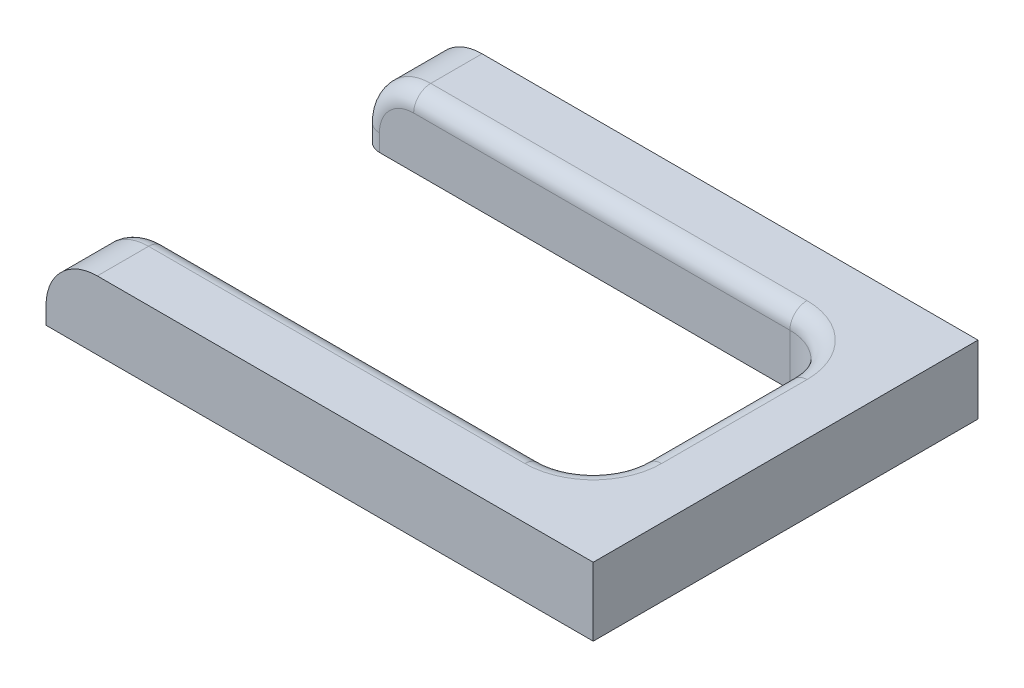
ISO-10303-21;
HEADER;
FILE_DESCRIPTION(('STEP AP214'),'2;1');
FILE_NAME('part.step','',(''),(''),'','','');
FILE_SCHEMA(('AUTOMOTIVE_DESIGN { 1 0 10303 214 1 1 1 1 }'));
ENDSEC;
DATA;
#1=APPLICATION_CONTEXT('core data for automotive mechanical design processes');
#2=APPLICATION_PROTOCOL_DEFINITION('international standard','automotive_design',2000,#1);
#3=PRODUCT_CONTEXT('',#1,'mechanical');
#4=PRODUCT('Part','Part','',(#3));
#5=PRODUCT_RELATED_PRODUCT_CATEGORY('part','',(#4));
#6=PRODUCT_DEFINITION_FORMATION('','',#4);
#7=PRODUCT_DEFINITION_CONTEXT('part definition',#1,'design');
#8=PRODUCT_DEFINITION('design','',#6,#7);
#9=PRODUCT_DEFINITION_SHAPE('','',#8);
#10=(LENGTH_UNIT() NAMED_UNIT(*) SI_UNIT(.MILLI.,.METRE.));
#11=(NAMED_UNIT(*) PLANE_ANGLE_UNIT() SI_UNIT($,.RADIAN.));
#12=(NAMED_UNIT(*) SI_UNIT($,.STERADIAN.) SOLID_ANGLE_UNIT());
#13=UNCERTAINTY_MEASURE_WITH_UNIT(LENGTH_MEASURE(1.E-05),#10,'distance_accuracy_value','');
#14=(GEOMETRIC_REPRESENTATION_CONTEXT(3) GLOBAL_UNCERTAINTY_ASSIGNED_CONTEXT((#13)) GLOBAL_UNIT_ASSIGNED_CONTEXT((#10,
#11,#12)) REPRESENTATION_CONTEXT('',''));
#15=CARTESIAN_POINT('',(0.,0.,0.));
#16=DIRECTION('',(0.,0.,1.));
#17=DIRECTION('',(1.,0.,0.));
#18=AXIS2_PLACEMENT_3D('',#15,#16,#17);
#19=CARTESIAN_POINT('',(-1.99999999999999,60.,50.));
#20=DIRECTION('',(0.,0.,-1.));
#21=DIRECTION('',(-1.,0.,0.));
#22=AXIS2_PLACEMENT_3D('',#19,#20,#21);
#23=PLANE('',#22);
#24=DIRECTION('',(1.,0.,0.));
#25=VECTOR('',#24,1.);
#26=CARTESIAN_POINT('',(-16.,60.,50.));
#27=LINE('',#26,#25);
#28=CARTESIAN_POINT('',(-14.5,60.,50.));
#29=VERTEX_POINT('',#28);
#30=CARTESIAN_POINT('',(0.,60.,50.));
#31=VERTEX_POINT('',#30);
#32=EDGE_CURVE('E155',#29,#31,#27,.T.);
#33=ORIENTED_EDGE('',*,*,#32,.F.);
#34=CARTESIAN_POINT('',(-14.5,58.5,50.));
#35=DIRECTION('',(0.,0.,-1.));
#36=DIRECTION('',(-1.,0.,0.));
#37=AXIS2_PLACEMENT_3D('',#34,#35,#36);
#38=CIRCLE('',#37,1.5);
#39=CARTESIAN_POINT('',(-16.,58.5,50.));
#40=VERTEX_POINT('',#39);
#41=EDGE_CURVE('E211',#29,#40,#38,.F.);
#42=ORIENTED_EDGE('',*,*,#41,.T.);
#43=DIRECTION('',(0.,-1.,0.));
#44=VECTOR('',#43,1.);
#45=CARTESIAN_POINT('',(-16.,60.,50.));
#46=LINE('',#45,#44);
#47=CARTESIAN_POINT('',(-16.,58.,50.));
#48=VERTEX_POINT('',#47);
#49=EDGE_CURVE('E183',#40,#48,#46,.T.);
#50=ORIENTED_EDGE('',*,*,#49,.T.);
#51=DIRECTION('',(1.,0.,0.));
#52=VECTOR('',#51,1.);
#53=CARTESIAN_POINT('',(-1.99999999999999,58.,50.));
#54=LINE('',#53,#52);
#55=CARTESIAN_POINT('',(0.,58.,50.));
#56=VERTEX_POINT('',#55);
#57=EDGE_CURVE('E172',#48,#56,#54,.T.);
#58=ORIENTED_EDGE('',*,*,#57,.T.);
#59=DIRECTION('',(0.,-1.,0.));
#60=VECTOR('',#59,1.);
#61=CARTESIAN_POINT('',(0.,60.,50.));
#62=LINE('',#61,#60);
#63=EDGE_CURVE('E169',#31,#56,#62,.T.);
#64=ORIENTED_EDGE('',*,*,#63,.F.);
#65=EDGE_LOOP('',(#33,#42,#50,#58,#64));
#66=FACE_BOUND('',#65,.T.);
#67=ADVANCED_FACE('F35',(#66),#23,.F.);
#68=CARTESIAN_POINT('',(0.,60.,50.));
#69=DIRECTION('',(-1.,0.,0.));
#70=DIRECTION('',(0.,0.,1.));
#71=AXIS2_PLACEMENT_3D('',#68,#69,#70);
#72=PLANE('',#71);
#73=DIRECTION('',(0.,0.,-1.));
#74=VECTOR('',#73,1.);
#75=CARTESIAN_POINT('',(0.,58.,50.));
#76=LINE('',#75,#74);
#77=CARTESIAN_POINT('',(0.,58.,38.75));
#78=VERTEX_POINT('',#77);
#79=EDGE_CURVE('E187',#56,#78,#76,.T.);
#80=ORIENTED_EDGE('',*,*,#79,.T.);
#81=DIRECTION('',(0.,-1.,0.));
#82=VECTOR('',#81,1.);
#83=CARTESIAN_POINT('',(0.,60.,38.75));
#84=LINE('',#83,#82);
#85=CARTESIAN_POINT('',(0.,60.,38.75));
#86=VERTEX_POINT('',#85);
#87=EDGE_CURVE('E176',#86,#78,#84,.T.);
#88=ORIENTED_EDGE('',*,*,#87,.F.);
#89=DIRECTION('',(0.,0.,-1.));
#90=VECTOR('',#89,1.);
#91=CARTESIAN_POINT('',(0.,60.,50.));
#92=LINE('',#91,#90);
#93=EDGE_CURVE('E160',#31,#86,#92,.T.);
#94=ORIENTED_EDGE('',*,*,#93,.F.);
#95=ORIENTED_EDGE('',*,*,#63,.T.);
#96=EDGE_LOOP('',(#80,#88,#94,#95));
#97=FACE_BOUND('',#96,.T.);
#98=ADVANCED_FACE('F178',(#97),#72,.F.);
#99=CARTESIAN_POINT('',(0.,60.,38.75));
#100=DIRECTION('',(0.,0.,1.));
#101=DIRECTION('',(1.,0.,0.));
#102=AXIS2_PLACEMENT_3D('',#99,#100,#101);
#103=PLANE('',#102);
#104=DIRECTION('',(0.,-1.,0.));
#105=VECTOR('',#104,1.);
#106=CARTESIAN_POINT('',(-16.,60.,38.75));
#107=LINE('',#106,#105);
#108=CARTESIAN_POINT('',(-16.,58.5,38.75));
#109=VERTEX_POINT('',#108);
#110=CARTESIAN_POINT('',(-16.,58.,38.75));
#111=VERTEX_POINT('',#110);
#112=EDGE_CURVE('E205',#109,#111,#107,.T.);
#113=ORIENTED_EDGE('',*,*,#112,.F.);
#114=CARTESIAN_POINT('',(-14.5,58.5,38.75));
#115=DIRECTION('',(0.,0.,1.));
#116=DIRECTION('',(1.,0.,0.));
#117=AXIS2_PLACEMENT_3D('',#114,#115,#116);
#118=CIRCLE('',#117,1.5);
#119=CARTESIAN_POINT('',(-14.5,60.,38.75));
#120=VERTEX_POINT('',#119);
#121=EDGE_CURVE('E218',#109,#120,#118,.F.);
#122=ORIENTED_EDGE('',*,*,#121,.T.);
#123=DIRECTION('',(-1.,0.,0.));
#124=VECTOR('',#123,1.);
#125=CARTESIAN_POINT('',(0.,60.,38.75));
#126=LINE('',#125,#124);
#127=EDGE_CURVE('E181',#86,#120,#126,.T.);
#128=ORIENTED_EDGE('',*,*,#127,.F.);
#129=ORIENTED_EDGE('',*,*,#87,.T.);
#130=DIRECTION('',(-1.,0.,0.));
#131=VECTOR('',#130,1.);
#132=CARTESIAN_POINT('',(0.,58.,38.75));
#133=LINE('',#132,#131);
#134=EDGE_CURVE('E189',#78,#111,#133,.T.);
#135=ORIENTED_EDGE('',*,*,#134,.T.);
#136=EDGE_LOOP('',(#113,#122,#128,#129,#135));
#137=FACE_BOUND('',#136,.T.);
#138=ADVANCED_FACE('F317',(#137),#103,.F.);
#139=CARTESIAN_POINT('',(-16.,60.,38.75));
#140=DIRECTION('',(1.,0.,0.));
#141=DIRECTION('',(0.,0.,-1.));
#142=AXIS2_PLACEMENT_3D('',#139,#140,#141);
#143=PLANE('',#142);
#144=DIRECTION('',(0.,0.,1.));
#145=VECTOR('',#144,1.);
#146=CARTESIAN_POINT('',(-16.,58.,38.75));
#147=LINE('',#146,#145);
#148=CARTESIAN_POINT('',(-16.,58.,40.25));
#149=VERTEX_POINT('',#148);
#150=EDGE_CURVE('E192',#111,#149,#147,.T.);
#151=ORIENTED_EDGE('',*,*,#150,.T.);
#152=DIRECTION('',(0.,-1.,0.));
#153=VECTOR('',#152,1.);
#154=CARTESIAN_POINT('',(-16.,60.,40.25));
#155=LINE('',#154,#153);
#156=CARTESIAN_POINT('',(-16.,58.5,40.25));
#157=VERTEX_POINT('',#156);
#158=EDGE_CURVE('E245',#149,#157,#155,.F.);
#159=ORIENTED_EDGE('',*,*,#158,.T.);
#160=DIRECTION('',(0.,0.,1.));
#161=VECTOR('',#160,1.);
#162=CARTESIAN_POINT('',(-16.,58.5,38.75));
#163=LINE('',#162,#161);
#164=EDGE_CURVE('E216',#157,#109,#163,.F.);
#165=ORIENTED_EDGE('',*,*,#164,.T.);
#166=ORIENTED_EDGE('',*,*,#112,.T.);
#167=EDGE_LOOP('',(#151,#159,#165,#166));
#168=FACE_BOUND('',#167,.T.);
#169=ADVANCED_FACE('F371',(#168),#143,.F.);
#170=CARTESIAN_POINT('',(-15.,60.,40.75));
#171=DIRECTION('',(0.,0.,-1.));
#172=DIRECTION('',(-1.,0.,0.));
#173=AXIS2_PLACEMENT_3D('',#170,#171,#172);
#174=PLANE('',#173);
#175=CARTESIAN_POINT('',(-14.5,58.5,40.75));
#176=DIRECTION('',(0.,0.,-1.));
#177=DIRECTION('',(-1.,0.,0.));
#178=AXIS2_PLACEMENT_3D('',#175,#176,#177);
#179=CIRCLE('',#178,1.);
#180=CARTESIAN_POINT('',(-14.5,59.5,40.75));
#181=VERTEX_POINT('',#180);
#182=CARTESIAN_POINT('',(-15.5,58.5,40.75));
#183=VERTEX_POINT('',#182);
#184=EDGE_CURVE('E236',#181,#183,#179,.F.);
#185=ORIENTED_EDGE('',*,*,#184,.T.);
#186=DIRECTION('',(0.,-1.,0.));
#187=VECTOR('',#186,1.);
#188=CARTESIAN_POINT('',(-15.5,60.,40.75));
#189=LINE('',#188,#187);
#190=CARTESIAN_POINT('',(-15.5,58.,40.75));
#191=VERTEX_POINT('',#190);
#192=EDGE_CURVE('E238',#183,#191,#189,.T.);
#193=ORIENTED_EDGE('',*,*,#192,.T.);
#194=DIRECTION('',(1.,0.,0.));
#195=VECTOR('',#194,1.);
#196=CARTESIAN_POINT('',(-15.,58.,40.75));
#197=LINE('',#196,#195);
#198=CARTESIAN_POINT('',(-3.5,58.,40.75));
#199=VERTEX_POINT('',#198);
#200=EDGE_CURVE('E195',#191,#199,#197,.T.);
#201=ORIENTED_EDGE('',*,*,#200,.T.);
#202=DIRECTION('',(0.,-1.,0.));
#203=VECTOR('',#202,1.);
#204=CARTESIAN_POINT('',(-3.49999999999999,60.,40.75));
#205=LINE('',#204,#203);
#206=CARTESIAN_POINT('',(-3.49999999999999,59.5,40.75));
#207=VERTEX_POINT('',#206);
#208=EDGE_CURVE('E226',#199,#207,#205,.F.);
#209=ORIENTED_EDGE('',*,*,#208,.T.);
#210=DIRECTION('',(1.,0.,0.));
#211=VECTOR('',#210,1.);
#212=CARTESIAN_POINT('',(-14.5,59.5,40.75));
#213=LINE('',#212,#211);
#214=EDGE_CURVE('E234',#207,#181,#213,.F.);
#215=ORIENTED_EDGE('',*,*,#214,.T.);
#216=EDGE_LOOP('',(#185,#193,#201,#209,#215));
#217=FACE_BOUND('',#216,.T.);
#218=ADVANCED_FACE('F335',(#217),#174,.F.);
#219=CARTESIAN_POINT('',(-1.99999999999999,60.,40.75));
#220=DIRECTION('',(1.,0.,0.));
#221=DIRECTION('',(0.,0.,-1.));
#222=AXIS2_PLACEMENT_3D('',#219,#220,#221);
#223=PLANE('',#222);
#224=DIRECTION('',(0.,-1.,0.));
#225=VECTOR('',#224,1.);
#226=CARTESIAN_POINT('',(-1.99999999999999,60.,46.5));
#227=LINE('',#226,#225);
#228=CARTESIAN_POINT('',(-1.99999999999999,58.,46.5));
#229=VERTEX_POINT('',#228);
#230=CARTESIAN_POINT('',(-1.99999999999999,59.5,46.5));
#231=VERTEX_POINT('',#230);
#232=EDGE_CURVE('E224',#229,#231,#227,.F.);
#233=ORIENTED_EDGE('',*,*,#232,.T.);
#234=DIRECTION('',(0.,0.,1.));
#235=VECTOR('',#234,1.);
#236=CARTESIAN_POINT('',(-1.99999999999999,59.5,42.25));
#237=LINE('',#236,#235);
#238=CARTESIAN_POINT('',(-1.99999999999999,59.5,42.25));
#239=VERTEX_POINT('',#238);
#240=EDGE_CURVE('E44',#231,#239,#237,.F.);
#241=ORIENTED_EDGE('',*,*,#240,.T.);
#242=DIRECTION('',(0.,-1.,0.));
#243=VECTOR('',#242,1.);
#244=CARTESIAN_POINT('',(-1.99999999999999,58.,42.25));
#245=LINE('',#244,#243);
#246=CARTESIAN_POINT('',(-1.99999999999999,58.,42.25));
#247=VERTEX_POINT('',#246);
#248=EDGE_CURVE('E222',#239,#247,#245,.T.);
#249=ORIENTED_EDGE('',*,*,#248,.T.);
#250=DIRECTION('',(0.,0.,1.));
#251=VECTOR('',#250,1.);
#252=CARTESIAN_POINT('',(-1.99999999999999,58.,40.75));
#253=LINE('',#252,#251);
#254=EDGE_CURVE('E197',#247,#229,#253,.T.);
#255=ORIENTED_EDGE('',*,*,#254,.T.);
#256=EDGE_LOOP('',(#233,#241,#249,#255));
#257=FACE_BOUND('',#256,.T.);
#258=ADVANCED_FACE('F363',(#257),#223,.F.);
#259=CARTESIAN_POINT('',(-1.99999999999999,60.,48.));
#260=DIRECTION('',(0.,0.,1.));
#261=DIRECTION('',(1.,0.,0.));
#262=AXIS2_PLACEMENT_3D('',#259,#260,#261);
#263=PLANE('',#262);
#264=DIRECTION('',(-1.,0.,0.));
#265=VECTOR('',#264,1.);
#266=CARTESIAN_POINT('',(-1.99999999999999,58.,48.));
#267=LINE('',#266,#265);
#268=CARTESIAN_POINT('',(-3.49999999999999,58.,48.));
#269=VERTEX_POINT('',#268);
#270=CARTESIAN_POINT('',(-15.5,58.,48.));
#271=VERTEX_POINT('',#270);
#272=EDGE_CURVE('E200',#269,#271,#267,.T.);
#273=ORIENTED_EDGE('',*,*,#272,.T.);
#274=DIRECTION('',(0.,-1.,0.));
#275=VECTOR('',#274,1.);
#276=CARTESIAN_POINT('',(-15.5,60.,48.));
#277=LINE('',#276,#275);
#278=CARTESIAN_POINT('',(-15.5,58.5,48.));
#279=VERTEX_POINT('',#278);
#280=EDGE_CURVE('E255',#271,#279,#277,.F.);
#281=ORIENTED_EDGE('',*,*,#280,.T.);
#282=CARTESIAN_POINT('',(-14.5,58.5,48.));
#283=DIRECTION('',(0.,0.,1.));
#284=DIRECTION('',(1.,0.,0.));
#285=AXIS2_PLACEMENT_3D('',#282,#283,#284);
#286=CIRCLE('',#285,1.);
#287=CARTESIAN_POINT('',(-14.5,59.5,48.));
#288=VERTEX_POINT('',#287);
#289=EDGE_CURVE('E253',#279,#288,#286,.F.);
#290=ORIENTED_EDGE('',*,*,#289,.T.);
#291=DIRECTION('',(-1.,0.,0.));
#292=VECTOR('',#291,1.);
#293=CARTESIAN_POINT('',(-3.49999999999999,59.5,48.));
#294=LINE('',#293,#292);
#295=CARTESIAN_POINT('',(-3.49999999999999,59.5,48.));
#296=VERTEX_POINT('',#295);
#297=EDGE_CURVE('E251',#288,#296,#294,.F.);
#298=ORIENTED_EDGE('',*,*,#297,.T.);
#299=DIRECTION('',(0.,-1.,0.));
#300=VECTOR('',#299,1.);
#301=CARTESIAN_POINT('',(-3.49999999999999,58.,48.));
#302=LINE('',#301,#300);
#303=EDGE_CURVE('E220',#296,#269,#302,.T.);
#304=ORIENTED_EDGE('',*,*,#303,.T.);
#305=EDGE_LOOP('',(#273,#281,#290,#298,#304));
#306=FACE_BOUND('',#305,.T.);
#307=ADVANCED_FACE('F360',(#306),#263,.F.);
#308=CARTESIAN_POINT('',(-16.,60.,50.));
#309=DIRECTION('',(1.,0.,0.));
#310=DIRECTION('',(0.,0.,-1.));
#311=AXIS2_PLACEMENT_3D('',#308,#309,#310);
#312=PLANE('',#311);
#313=DIRECTION('',(0.,0.,1.));
#314=VECTOR('',#313,1.);
#315=CARTESIAN_POINT('',(-16.,58.5,48.));
#316=LINE('',#315,#314);
#317=CARTESIAN_POINT('',(-16.,58.5,48.5));
#318=VERTEX_POINT('',#317);
#319=EDGE_CURVE('E213',#40,#318,#316,.F.);
#320=ORIENTED_EDGE('',*,*,#319,.T.);
#321=DIRECTION('',(0.,-1.,0.));
#322=VECTOR('',#321,1.);
#323=CARTESIAN_POINT('',(-16.,60.,48.5));
#324=LINE('',#323,#322);
#325=CARTESIAN_POINT('',(-16.,58.,48.5));
#326=VERTEX_POINT('',#325);
#327=EDGE_CURVE('E249',#318,#326,#324,.T.);
#328=ORIENTED_EDGE('',*,*,#327,.T.);
#329=DIRECTION('',(0.,0.,1.));
#330=VECTOR('',#329,1.);
#331=CARTESIAN_POINT('',(-16.,58.,50.));
#332=LINE('',#331,#330);
#333=EDGE_CURVE('E166',#326,#48,#332,.T.);
#334=ORIENTED_EDGE('',*,*,#333,.T.);
#335=ORIENTED_EDGE('',*,*,#49,.F.);
#336=EDGE_LOOP('',(#320,#328,#334,#335));
#337=FACE_BOUND('',#336,.T.);
#338=ADVANCED_FACE('F306',(#337),#312,.F.);
#339=CARTESIAN_POINT('',(0.,60.,50.));
#340=DIRECTION('',(0.,1.,0.));
#341=DIRECTION('',(0.,0.,1.));
#342=AXIS2_PLACEMENT_3D('',#339,#340,#341);
#343=PLANE('',#342);
#344=CARTESIAN_POINT('',(-3.49999999999999,60.,46.5));
#345=DIRECTION('',(0.,1.,0.));
#346=DIRECTION('',(0.,0.,1.));
#347=AXIS2_PLACEMENT_3D('',#344,#345,#346);
#348=CIRCLE('',#347,2.);
#349=CARTESIAN_POINT('',(-1.49999999999999,60.,46.5));
#350=VERTEX_POINT('',#349);
#351=CARTESIAN_POINT('',(-3.49999999999999,60.,48.5));
#352=VERTEX_POINT('',#351);
#353=EDGE_CURVE('E265',#350,#352,#348,.F.);
#354=ORIENTED_EDGE('',*,*,#353,.T.);
#355=DIRECTION('',(-1.,0.,0.));
#356=VECTOR('',#355,1.);
#357=CARTESIAN_POINT('',(-14.5,60.,48.5));
#358=LINE('',#357,#356);
#359=CARTESIAN_POINT('',(-14.5,60.,48.5));
#360=VERTEX_POINT('',#359);
#361=EDGE_CURVE('E267',#352,#360,#358,.T.);
#362=ORIENTED_EDGE('',*,*,#361,.T.);
#363=DIRECTION('',(0.,0.,1.));
#364=VECTOR('',#363,1.);
#365=CARTESIAN_POINT('',(-14.5,60.,50.));
#366=LINE('',#365,#364);
#367=EDGE_CURVE('E163',#360,#29,#366,.T.);
#368=ORIENTED_EDGE('',*,*,#367,.T.);
#369=ORIENTED_EDGE('',*,*,#32,.T.);
#370=ORIENTED_EDGE('',*,*,#93,.T.);
#371=ORIENTED_EDGE('',*,*,#127,.T.);
#372=DIRECTION('',(0.,0.,1.));
#373=VECTOR('',#372,1.);
#374=CARTESIAN_POINT('',(-14.5,60.,40.75));
#375=LINE('',#374,#373);
#376=CARTESIAN_POINT('',(-14.5,60.,40.25));
#377=VERTEX_POINT('',#376);
#378=EDGE_CURVE('E175',#120,#377,#375,.T.);
#379=ORIENTED_EDGE('',*,*,#378,.T.);
#380=DIRECTION('',(1.,0.,0.));
#381=VECTOR('',#380,1.);
#382=CARTESIAN_POINT('',(-3.49999999999999,60.,40.25));
#383=LINE('',#382,#381);
#384=CARTESIAN_POINT('',(-3.49999999999999,60.,40.25));
#385=VERTEX_POINT('',#384);
#386=EDGE_CURVE('E259',#377,#385,#383,.T.);
#387=ORIENTED_EDGE('',*,*,#386,.T.);
#388=CARTESIAN_POINT('',(-3.49999999999999,60.,42.25));
#389=DIRECTION('',(0.,1.,0.));
#390=DIRECTION('',(0.,0.,1.));
#391=AXIS2_PLACEMENT_3D('',#388,#389,#390);
#392=CIRCLE('',#391,2.);
#393=CARTESIAN_POINT('',(-1.49999999999999,60.,42.25));
#394=VERTEX_POINT('',#393);
#395=EDGE_CURVE('E261',#385,#394,#392,.F.);
#396=ORIENTED_EDGE('',*,*,#395,.T.);
#397=DIRECTION('',(0.,0.,1.));
#398=VECTOR('',#397,1.);
#399=CARTESIAN_POINT('',(-1.49999999999999,60.,46.5));
#400=LINE('',#399,#398);
#401=EDGE_CURVE('E263',#394,#350,#400,.T.);
#402=ORIENTED_EDGE('',*,*,#401,.T.);
#403=EDGE_LOOP('',(#354,#362,#368,#369,#370,#371,#379,#387,#396,#402));
#404=FACE_BOUND('',#403,.T.);
#405=ADVANCED_FACE('F157',(#404),#343,.T.);
#406=CARTESIAN_POINT('',(0.,58.,50.));
#407=DIRECTION('',(0.,1.,0.));
#408=DIRECTION('',(0.,0.,1.));
#409=AXIS2_PLACEMENT_3D('',#406,#407,#408);
#410=PLANE('',#409);
#411=ORIENTED_EDGE('',*,*,#200,.F.);
#412=CARTESIAN_POINT('',(-15.5,58.,40.25));
#413=DIRECTION('',(0.,1.,0.));
#414=DIRECTION('',(0.,0.,1.));
#415=AXIS2_PLACEMENT_3D('',#412,#413,#414);
#416=CIRCLE('',#415,0.5);
#417=EDGE_CURVE('E243',#191,#149,#416,.F.);
#418=ORIENTED_EDGE('',*,*,#417,.T.);
#419=ORIENTED_EDGE('',*,*,#150,.F.);
#420=ORIENTED_EDGE('',*,*,#134,.F.);
#421=ORIENTED_EDGE('',*,*,#79,.F.);
#422=ORIENTED_EDGE('',*,*,#57,.F.);
#423=ORIENTED_EDGE('',*,*,#333,.F.);
#424=CARTESIAN_POINT('',(-15.5,58.,48.5));
#425=DIRECTION('',(0.,1.,0.));
#426=DIRECTION('',(0.,0.,1.));
#427=AXIS2_PLACEMENT_3D('',#424,#425,#426);
#428=CIRCLE('',#427,0.5);
#429=EDGE_CURVE('E241',#326,#271,#428,.F.);
#430=ORIENTED_EDGE('',*,*,#429,.T.);
#431=ORIENTED_EDGE('',*,*,#272,.F.);
#432=CARTESIAN_POINT('',(-3.49999999999999,58.,46.5));
#433=DIRECTION('',(0.,1.,0.));
#434=DIRECTION('',(0.,0.,1.));
#435=AXIS2_PLACEMENT_3D('',#432,#433,#434);
#436=CIRCLE('',#435,1.5);
#437=EDGE_CURVE('E229',#269,#229,#436,.T.);
#438=ORIENTED_EDGE('',*,*,#437,.T.);
#439=ORIENTED_EDGE('',*,*,#254,.F.);
#440=CARTESIAN_POINT('',(-3.49999999999999,58.,42.25));
#441=DIRECTION('',(0.,1.,0.));
#442=DIRECTION('',(0.,0.,1.));
#443=AXIS2_PLACEMENT_3D('',#440,#441,#442);
#444=CIRCLE('',#443,1.5);
#445=EDGE_CURVE('E231',#247,#199,#444,.T.);
#446=ORIENTED_EDGE('',*,*,#445,.T.);
#447=EDGE_LOOP('',(#411,#418,#419,#420,#421,#422,#423,#430,#431,#438,#439,#446));
#448=FACE_BOUND('',#447,.T.);
#449=ADVANCED_FACE('F311',(#448),#410,.F.);
#450=CARTESIAN_POINT('',(-14.5,58.5,50.));
#451=DIRECTION('',(0.,0.,-1.));
#452=DIRECTION('',(-1.,0.,0.));
#453=AXIS2_PLACEMENT_3D('',#450,#451,#452);
#454=CYLINDRICAL_SURFACE('',#453,1.5);
#455=ORIENTED_EDGE('',*,*,#367,.F.);
#456=CARTESIAN_POINT('',(-14.5,58.5,48.5));
#457=DIRECTION('',(0.,0.,1.));
#458=DIRECTION('',(1.,0.,0.));
#459=AXIS2_PLACEMENT_3D('',#456,#457,#458);
#460=CIRCLE('',#459,1.5);
#461=EDGE_CURVE('E257',#360,#318,#460,.T.);
#462=ORIENTED_EDGE('',*,*,#461,.T.);
#463=ORIENTED_EDGE('',*,*,#319,.F.);
#464=ORIENTED_EDGE('',*,*,#41,.F.);
#465=EDGE_LOOP('',(#455,#462,#463,#464));
#466=FACE_BOUND('',#465,.T.);
#467=ADVANCED_FACE('F381',(#466),#454,.T.);
#468=CARTESIAN_POINT('',(-14.5,58.5,50.));
#469=DIRECTION('',(0.,0.,-1.));
#470=DIRECTION('',(-1.,0.,0.));
#471=AXIS2_PLACEMENT_3D('',#468,#469,#470);
#472=CYLINDRICAL_SURFACE('',#471,1.5);
#473=ORIENTED_EDGE('',*,*,#164,.F.);
#474=CARTESIAN_POINT('',(-14.5,58.5,40.25));
#475=DIRECTION('',(0.,0.,-1.));
#476=DIRECTION('',(-1.,0.,0.));
#477=AXIS2_PLACEMENT_3D('',#474,#475,#476);
#478=CIRCLE('',#477,1.5);
#479=EDGE_CURVE('E247',#157,#377,#478,.T.);
#480=ORIENTED_EDGE('',*,*,#479,.T.);
#481=ORIENTED_EDGE('',*,*,#378,.F.);
#482=ORIENTED_EDGE('',*,*,#121,.F.);
#483=EDGE_LOOP('',(#473,#480,#481,#482));
#484=FACE_BOUND('',#483,.T.);
#485=ADVANCED_FACE('F323',(#484),#472,.T.);
#486=CARTESIAN_POINT('',(-3.49999999999999,60.,46.5));
#487=DIRECTION('',(0.,1.,0.));
#488=DIRECTION('',(0.,0.,1.));
#489=AXIS2_PLACEMENT_3D('',#486,#487,#488);
#490=CYLINDRICAL_SURFACE('',#489,1.5);
#491=ORIENTED_EDGE('',*,*,#303,.F.);
#492=CARTESIAN_POINT('',(-3.49999999999999,59.5,46.5));
#493=DIRECTION('',(0.,1.,0.));
#494=DIRECTION('',(0.,0.,1.));
#495=AXIS2_PLACEMENT_3D('',#492,#493,#494);
#496=CIRCLE('',#495,1.5);
#497=EDGE_CURVE('E59',#296,#231,#496,.T.);
#498=ORIENTED_EDGE('',*,*,#497,.T.);
#499=ORIENTED_EDGE('',*,*,#232,.F.);
#500=ORIENTED_EDGE('',*,*,#437,.F.);
#501=EDGE_LOOP('',(#491,#498,#499,#500));
#502=FACE_BOUND('',#501,.T.);
#503=ADVANCED_FACE('F362',(#502),#490,.F.);
#504=CARTESIAN_POINT('',(-3.49999999999999,60.,42.25));
#505=DIRECTION('',(0.,1.,0.));
#506=DIRECTION('',(0.,0.,1.));
#507=AXIS2_PLACEMENT_3D('',#504,#505,#506);
#508=CYLINDRICAL_SURFACE('',#507,1.5);
#509=ORIENTED_EDGE('',*,*,#248,.F.);
#510=CARTESIAN_POINT('',(-3.49999999999999,59.5,42.25));
#511=DIRECTION('',(0.,1.,0.));
#512=DIRECTION('',(0.,0.,1.));
#513=AXIS2_PLACEMENT_3D('',#510,#511,#512);
#514=CIRCLE('',#513,1.5);
#515=EDGE_CURVE('E11',#239,#207,#514,.T.);
#516=ORIENTED_EDGE('',*,*,#515,.T.);
#517=ORIENTED_EDGE('',*,*,#208,.F.);
#518=ORIENTED_EDGE('',*,*,#445,.F.);
#519=EDGE_LOOP('',(#509,#516,#517,#518));
#520=FACE_BOUND('',#519,.T.);
#521=ADVANCED_FACE('F340',(#520),#508,.F.);
#522=CARTESIAN_POINT('',(-15.5,60.,48.5));
#523=DIRECTION('',(0.,-1.,0.));
#524=DIRECTION('',(0.,0.,-1.));
#525=AXIS2_PLACEMENT_3D('',#522,#523,#524);
#526=CYLINDRICAL_SURFACE('',#525,0.5);
#527=ORIENTED_EDGE('',*,*,#429,.F.);
#528=ORIENTED_EDGE('',*,*,#327,.F.);
#529=CARTESIAN_POINT('',(-15.5,58.5,48.5));
#530=DIRECTION('',(0.,1.,0.));
#531=DIRECTION('',(0.,0.,1.));
#532=AXIS2_PLACEMENT_3D('',#529,#530,#531);
#533=CIRCLE('',#532,0.5);
#534=EDGE_CURVE('E39',#279,#318,#533,.T.);
#535=ORIENTED_EDGE('',*,*,#534,.F.);
#536=ORIENTED_EDGE('',*,*,#280,.F.);
#537=EDGE_LOOP('',(#527,#528,#535,#536));
#538=FACE_BOUND('',#537,.T.);
#539=ADVANCED_FACE('F37',(#538),#526,.T.);
#540=CARTESIAN_POINT('',(-14.5,58.5,48.5));
#541=DIRECTION('',(0.,0.,1.));
#542=DIRECTION('',(1.,0.,0.));
#543=AXIS2_PLACEMENT_3D('',#540,#541,#542);
#544=TOROIDAL_SURFACE('',#543,1.,0.5);
#545=ORIENTED_EDGE('',*,*,#534,.T.);
#546=ORIENTED_EDGE('',*,*,#461,.F.);
#547=CARTESIAN_POINT('',(-14.5,59.5,48.5));
#548=DIRECTION('',(1.,0.,0.));
#549=DIRECTION('',(0.,0.,-1.));
#550=AXIS2_PLACEMENT_3D('',#547,#548,#549);
#551=CIRCLE('',#550,0.5);
#552=EDGE_CURVE('E288',#288,#360,#551,.T.);
#553=ORIENTED_EDGE('',*,*,#552,.F.);
#554=ORIENTED_EDGE('',*,*,#289,.F.);
#555=EDGE_LOOP('',(#545,#546,#553,#554));
#556=FACE_BOUND('',#555,.T.);
#557=ADVANCED_FACE('F299',(#556),#544,.T.);
#558=CARTESIAN_POINT('',(0.,59.5,48.5));
#559=DIRECTION('',(1.,0.,0.));
#560=DIRECTION('',(0.,0.,-1.));
#561=AXIS2_PLACEMENT_3D('',#558,#559,#560);
#562=CYLINDRICAL_SURFACE('',#561,0.5);
#563=ORIENTED_EDGE('',*,*,#552,.T.);
#564=ORIENTED_EDGE('',*,*,#361,.F.);
#565=CARTESIAN_POINT('',(-3.49999999999999,59.5,48.5));
#566=DIRECTION('',(1.,0.,0.));
#567=DIRECTION('',(0.,0.,-1.));
#568=AXIS2_PLACEMENT_3D('',#565,#566,#567);
#569=CIRCLE('',#568,0.5);
#570=EDGE_CURVE('E286',#296,#352,#569,.T.);
#571=ORIENTED_EDGE('',*,*,#570,.F.);
#572=ORIENTED_EDGE('',*,*,#297,.F.);
#573=EDGE_LOOP('',(#563,#564,#571,#572));
#574=FACE_BOUND('',#573,.T.);
#575=ADVANCED_FACE('F358',(#574),#562,.T.);
#576=CARTESIAN_POINT('',(-3.49999999999999,59.5,46.5));
#577=DIRECTION('',(0.,1.,0.));
#578=DIRECTION('',(0.,0.,1.));
#579=AXIS2_PLACEMENT_3D('',#576,#577,#578);
#580=TOROIDAL_SURFACE('',#579,2.,0.5);
#581=ORIENTED_EDGE('',*,*,#570,.T.);
#582=ORIENTED_EDGE('',*,*,#353,.F.);
#583=CARTESIAN_POINT('',(-1.49999999999999,59.5,46.5));
#584=DIRECTION('',(0.,0.,-1.));
#585=DIRECTION('',(-1.,0.,0.));
#586=AXIS2_PLACEMENT_3D('',#583,#584,#585);
#587=CIRCLE('',#586,0.5);
#588=EDGE_CURVE('E283',#231,#350,#587,.T.);
#589=ORIENTED_EDGE('',*,*,#588,.F.);
#590=ORIENTED_EDGE('',*,*,#497,.F.);
#591=EDGE_LOOP('',(#581,#582,#589,#590));
#592=FACE_BOUND('',#591,.T.);
#593=ADVANCED_FACE('F356',(#592),#580,.T.);
#594=CARTESIAN_POINT('',(-1.49999999999999,59.5,50.));
#595=DIRECTION('',(0.,0.,-1.));
#596=DIRECTION('',(-1.,0.,0.));
#597=AXIS2_PLACEMENT_3D('',#594,#595,#596);
#598=CYLINDRICAL_SURFACE('',#597,0.5);
#599=ORIENTED_EDGE('',*,*,#588,.T.);
#600=ORIENTED_EDGE('',*,*,#401,.F.);
#601=CARTESIAN_POINT('',(-1.49999999999999,59.5,42.25));
#602=DIRECTION('',(0.,0.,-1.));
#603=DIRECTION('',(-1.,0.,0.));
#604=AXIS2_PLACEMENT_3D('',#601,#602,#603);
#605=CIRCLE('',#604,0.5);
#606=EDGE_CURVE('E280',#239,#394,#605,.T.);
#607=ORIENTED_EDGE('',*,*,#606,.F.);
#608=ORIENTED_EDGE('',*,*,#240,.F.);
#609=EDGE_LOOP('',(#599,#600,#607,#608));
#610=FACE_BOUND('',#609,.T.);
#611=ADVANCED_FACE('F353',(#610),#598,.T.);
#612=CARTESIAN_POINT('',(-3.49999999999999,59.5,42.25));
#613=DIRECTION('',(0.,1.,0.));
#614=DIRECTION('',(0.,0.,1.));
#615=AXIS2_PLACEMENT_3D('',#612,#613,#614);
#616=TOROIDAL_SURFACE('',#615,2.,0.5);
#617=ORIENTED_EDGE('',*,*,#606,.T.);
#618=ORIENTED_EDGE('',*,*,#395,.F.);
#619=CARTESIAN_POINT('',(-3.49999999999999,59.5,40.25));
#620=DIRECTION('',(-1.,0.,0.));
#621=DIRECTION('',(0.,0.,1.));
#622=AXIS2_PLACEMENT_3D('',#619,#620,#621);
#623=CIRCLE('',#622,0.5);
#624=EDGE_CURVE('E277',#207,#385,#623,.T.);
#625=ORIENTED_EDGE('',*,*,#624,.F.);
#626=ORIENTED_EDGE('',*,*,#515,.F.);
#627=EDGE_LOOP('',(#617,#618,#625,#626));
#628=FACE_BOUND('',#627,.T.);
#629=ADVANCED_FACE('F346',(#628),#616,.T.);
#630=CARTESIAN_POINT('',(0.,59.5,40.25));
#631=DIRECTION('',(-1.,0.,0.));
#632=DIRECTION('',(0.,0.,1.));
#633=AXIS2_PLACEMENT_3D('',#630,#631,#632);
#634=CYLINDRICAL_SURFACE('',#633,0.5);
#635=ORIENTED_EDGE('',*,*,#624,.T.);
#636=ORIENTED_EDGE('',*,*,#386,.F.);
#637=CARTESIAN_POINT('',(-14.5,59.5,40.25));
#638=DIRECTION('',(-1.,0.,0.));
#639=DIRECTION('',(0.,0.,1.));
#640=AXIS2_PLACEMENT_3D('',#637,#638,#639);
#641=CIRCLE('',#640,0.5);
#642=EDGE_CURVE('E274',#181,#377,#641,.T.);
#643=ORIENTED_EDGE('',*,*,#642,.F.);
#644=ORIENTED_EDGE('',*,*,#214,.F.);
#645=EDGE_LOOP('',(#635,#636,#643,#644));
#646=FACE_BOUND('',#645,.T.);
#647=ADVANCED_FACE('F348',(#646),#634,.T.);
#648=CARTESIAN_POINT('',(-14.5,58.5,40.25));
#649=DIRECTION('',(0.,0.,-1.));
#650=DIRECTION('',(-1.,0.,0.));
#651=AXIS2_PLACEMENT_3D('',#648,#649,#650);
#652=TOROIDAL_SURFACE('',#651,1.,0.5);
#653=ORIENTED_EDGE('',*,*,#642,.T.);
#654=ORIENTED_EDGE('',*,*,#479,.F.);
#655=CARTESIAN_POINT('',(-15.5,58.5,40.25));
#656=DIRECTION('',(0.,-1.,0.));
#657=DIRECTION('',(0.,0.,-1.));
#658=AXIS2_PLACEMENT_3D('',#655,#656,#657);
#659=CIRCLE('',#658,0.5);
#660=EDGE_CURVE('E271',#183,#157,#659,.T.);
#661=ORIENTED_EDGE('',*,*,#660,.F.);
#662=ORIENTED_EDGE('',*,*,#184,.F.);
#663=EDGE_LOOP('',(#653,#654,#661,#662));
#664=FACE_BOUND('',#663,.T.);
#665=ADVANCED_FACE('F327',(#664),#652,.T.);
#666=CARTESIAN_POINT('',(-15.5,60.,40.25));
#667=DIRECTION('',(0.,-1.,0.));
#668=DIRECTION('',(0.,0.,-1.));
#669=AXIS2_PLACEMENT_3D('',#666,#667,#668);
#670=CYLINDRICAL_SURFACE('',#669,0.5);
#671=ORIENTED_EDGE('',*,*,#660,.T.);
#672=ORIENTED_EDGE('',*,*,#158,.F.);
#673=ORIENTED_EDGE('',*,*,#417,.F.);
#674=ORIENTED_EDGE('',*,*,#192,.F.);
#675=EDGE_LOOP('',(#671,#672,#673,#674));
#676=FACE_BOUND('',#675,.T.);
#677=ADVANCED_FACE('F333',(#676),#670,.T.);
#678=CLOSED_SHELL('',(#67,#98,#138,#169,#218,#258,#307,#338,#405,#449,#467,#485,#503,#521,#539,
#557,#575,#593,#611,#629,#647,#665,#677));
#679=MANIFOLD_SOLID_BREP('B2',#678);
#680=ADVANCED_BREP_SHAPE_REPRESENTATION('',(#18,#679),#14);
#681=SHAPE_DEFINITION_REPRESENTATION(#9,#680);
ENDSEC;
END-ISO-10303-21;
